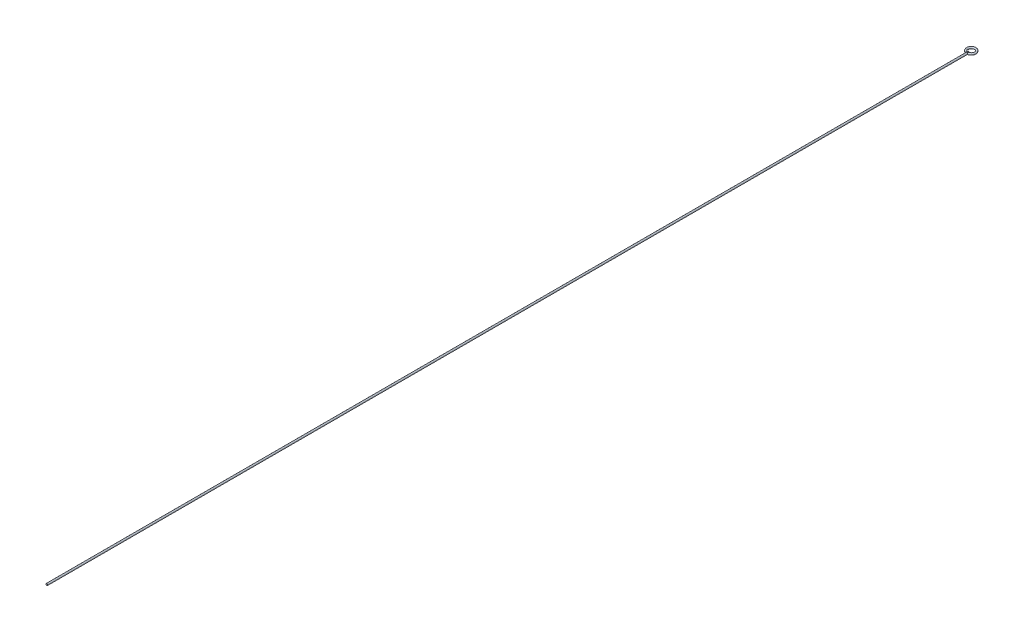
ISO-10303-21;
HEADER;
FILE_DESCRIPTION(('STEP AP214'),'2;1');
FILE_NAME('part.step','',(''),(''),'','','');
FILE_SCHEMA(('AUTOMOTIVE_DESIGN { 1 0 10303 214 1 1 1 1 }'));
ENDSEC;
DATA;
#1=APPLICATION_CONTEXT('core data for automotive mechanical design processes');
#2=APPLICATION_PROTOCOL_DEFINITION('international standard','automotive_design',2000,#1);
#3=PRODUCT_CONTEXT('',#1,'mechanical');
#4=PRODUCT('Part','Part','',(#3));
#5=PRODUCT_RELATED_PRODUCT_CATEGORY('part','',(#4));
#6=PRODUCT_DEFINITION_FORMATION('','',#4);
#7=PRODUCT_DEFINITION_CONTEXT('part definition',#1,'design');
#8=PRODUCT_DEFINITION('design','',#6,#7);
#9=PRODUCT_DEFINITION_SHAPE('','',#8);
#10=(LENGTH_UNIT() NAMED_UNIT(*) SI_UNIT(.MILLI.,.METRE.));
#11=(NAMED_UNIT(*) PLANE_ANGLE_UNIT() SI_UNIT($,.RADIAN.));
#12=(NAMED_UNIT(*) SI_UNIT($,.STERADIAN.) SOLID_ANGLE_UNIT());
#13=UNCERTAINTY_MEASURE_WITH_UNIT(LENGTH_MEASURE(1.E-05),#10,'distance_accuracy_value','');
#14=(GEOMETRIC_REPRESENTATION_CONTEXT(3) GLOBAL_UNCERTAINTY_ASSIGNED_CONTEXT((#13)) GLOBAL_UNIT_ASSIGNED_CONTEXT((#10,
#11,#12)) REPRESENTATION_CONTEXT('',''));
#15=CARTESIAN_POINT('',(0.,0.,0.));
#16=DIRECTION('',(0.,0.,1.));
#17=DIRECTION('',(1.,0.,0.));
#18=AXIS2_PLACEMENT_3D('',#15,#16,#17);
#19=CARTESIAN_POINT('',(0.,0.,2131.));
#20=DIRECTION('',(0.,0.,-1.));
#21=DIRECTION('',(-1.,0.,0.));
#22=AXIS2_PLACEMENT_3D('',#19,#20,#21);
#23=CYLINDRICAL_SURFACE('',#22,2.);
#24=CARTESIAN_POINT('',(0.,0.,6.));
#25=DIRECTION('',(0.,0.,1.));
#26=DIRECTION('',(1.,0.,0.));
#27=AXIS2_PLACEMENT_3D('',#24,#25,#26);
#28=CIRCLE('',#27,2.);
#29=CARTESIAN_POINT('',(2.,0.,6.));
#30=VERTEX_POINT('',#29);
#31=EDGE_CURVE('E141',#30,#30,#28,.T.);
#32=ORIENTED_EDGE('',*,*,#31,.T.);
#33=EDGE_LOOP('',(#32));
#34=FACE_BOUND('',#33,.T.);
#35=CARTESIAN_POINT('',(0.,0.,8.99999999999995));
#36=DIRECTION('',(0.,-0.707106781186547,-0.707106781186547));
#37=DIRECTION('',(0.,0.707106781186547,-0.707106781186547));
#38=AXIS2_PLACEMENT_3D('',#35,#36,#37);
#39=ELLIPSE('',#38,2.82842712474619,2.);
#40=CARTESIAN_POINT('',(1.35264002569453,1.47321585685503,7.52678414314496));
#41=VERTEX_POINT('',#40);
#42=CARTESIAN_POINT('',(-1.35264002569453,1.47321585685503,7.52678414314496));
#43=VERTEX_POINT('',#42);
#44=EDGE_CURVE('E67',#41,#43,#39,.F.);
#45=ORIENTED_EDGE('',*,*,#44,.F.);
#46=CARTESIAN_POINT('',(0.,2.,9.));
#47=CARTESIAN_POINT('',(0.00210812272485549,1.99999999524163,8.99789188802901));
#48=CARTESIAN_POINT('',(0.00421593956644162,1.99999666225178,8.99578333024149));
#49=CARTESIAN_POINT('',(0.167613924135622,1.99948039837144,8.83226960574343));
#50=CARTESIAN_POINT('',(0.327073545426945,1.97949150565761,8.66829200657743));
#51=CARTESIAN_POINT('',(0.559345306955797,1.92185890331424,8.42250655543371));
#52=CARTESIAN_POINT('',(0.635774550072601,1.89795770338682,8.34043033607726));
#53=CARTESIAN_POINT('',(0.785828632202429,1.84089832490799,8.17690254413226));
#54=CARTESIAN_POINT('',(0.859454740640768,1.80774439459674,8.09545070246308));
#55=CARTESIAN_POINT('',(0.986802312314143,1.74073148220367,7.95244891859763));
#56=CARTESIAN_POINT('',(1.04121847231176,1.70877538708495,7.89061593086873));
#57=CARTESIAN_POINT('',(1.14772281824378,1.63913978914488,7.7681871378529));
#58=CARTESIAN_POINT('',(1.19981153935845,1.60146161093816,7.70759104990733));
#59=CARTESIAN_POINT('',(1.30118823189935,1.5202366704838,7.58829101877278));
#60=CARTESIAN_POINT('',(1.35048232911553,1.47670351006603,7.52958306965177));
#61=CARTESIAN_POINT('',(1.44590645589761,1.3834030904459,7.41464671127423));
#62=CARTESIAN_POINT('',(1.49203807201466,1.3336389931221,7.35841706383646));
#63=CARTESIAN_POINT('',(1.59107508834011,1.21482851937822,7.23637955182586));
#64=CARTESIAN_POINT('',(1.64298967668924,1.14400888206332,7.17146570606956));
#65=CARTESIAN_POINT('',(1.73936977351839,0.991323551090359,7.04947167026083));
#66=CARTESIAN_POINT('',(1.78384415074728,0.909471221739623,6.99238216846505));
#67=CARTESIAN_POINT('',(1.85334026653697,0.755288037111378,6.9022751968222));
#68=CARTESIAN_POINT('',(1.88046912857674,0.685383347646647,6.86676841761969));
#69=CARTESIAN_POINT('',(1.92743179933544,0.539316860970757,6.80493837359133));
#70=CARTESIAN_POINT('',(1.94727704682289,0.463165106806872,6.77860071222888));
#71=CARTESIAN_POINT('',(1.97556961285693,0.318783066173252,6.74092329606359));
#72=CARTESIAN_POINT('',(1.98534423195506,0.251273624055717,6.7278429328771));
#73=CARTESIAN_POINT('',(1.99790013385232,0.114464445911381,6.7110261722765));
#74=CARTESIAN_POINT('',(2.00068618016804,0.0451659618898008,6.70728341022207));
#75=CARTESIAN_POINT('',(1.99902507748093,-0.0932269459276112,6.70951183766348));
#76=CARTESIAN_POINT('',(1.99457331702574,-0.162321211505731,6.71548922019384));
#77=CARTESIAN_POINT('',(1.97881704351064,-0.298296919509378,6.73657185136085));
#78=CARTESIAN_POINT('',(1.96750720820041,-0.365176600738755,6.75168418920589));
#79=CARTESIAN_POINT('',(1.93506816593579,-0.512441459084677,6.79480275118913));
#80=CARTESIAN_POINT('',(1.91213546025074,-0.591734040697845,6.82515897002035));
#81=CARTESIAN_POINT('',(1.85856088034207,-0.743125211635407,6.89544348555838));
#82=CARTESIAN_POINT('',(1.82790417359937,-0.815209582570209,6.93539019199368));
#83=CARTESIAN_POINT('',(1.74457274468806,-0.984436833153287,7.04285113385104));
#84=CARTESIAN_POINT('',(1.6883570290898,-1.07721453123317,7.11444602840009));
#85=CARTESIAN_POINT('',(1.56655663215454,-1.24776658358752,7.26689981805269));
#86=CARTESIAN_POINT('',(1.50095088388114,-1.32550625145298,7.34777946086476));
#87=CARTESIAN_POINT('',(1.37952593702835,-1.45000149540649,7.49483605281066));
#88=CARTESIAN_POINT('',(1.32520348461172,-1.49969547185001,7.55980886574149));
#89=CARTESIAN_POINT('',(1.21314827324628,-1.5917071804358,7.69205451956285));
#90=CARTESIAN_POINT('',(1.15541377381436,-1.63402110376991,7.75932852679196));
#91=CARTESIAN_POINT('',(1.03704301514678,-1.71159292484037,7.89543290864361));
#92=CARTESIAN_POINT('',(0.976405158426919,-1.74684688145539,7.96426412882959));
#93=CARTESIAN_POINT('',(0.852660755306097,-1.81047203631426,8.10289576687222));
#94=CARTESIAN_POINT('',(0.78955348783574,-1.83884120651604,8.17269646392042));
#95=CARTESIAN_POINT('',(0.610804546614742,-1.90841633093616,8.36786297402596));
#96=CARTESIAN_POINT('',(0.492836854291632,-1.942200198497,8.49380520408929));
#97=CARTESIAN_POINT('',(0.252404421297302,-1.98776362380408,8.74485234646825));
#98=CARTESIAN_POINT('',(0.129951986381222,-1.99959937761332,8.86995857770249));
#99=CARTESIAN_POINT('',(0.00421596897733761,-1.99999666242279,8.99578329472263));
#100=CARTESIAN_POINT('',(0.00210815236588643,-1.99999999546546,8.99789185220298));
#101=CARTESIAN_POINT('',(0.,-2.,9.));
#102=B_SPLINE_CURVE_WITH_KNOTS('',3,(#46,#47,#48,#49,#50,#51,#52,#53,#54,#55,#56,#57,#58,#59,
#60,#61,#62,#63,#64,#65,#66,#67,#68,#69,#70,#71,#72,#73,#74,#75,#76,#77,#78,#79,#80,#81,#82,#83,
#84,#85,#86,#87,#88,#89,#90,#91,#92,#93,#94,#95,#96,#97,#98,#99,#100,#101),.UNSPECIFIED.,.F.,
.F.,(4,2,2,2,2,2,2,2,2,2,2,2,2,2,2,2,2,2,2,2,2,2,2,2,2,2,2,4),(0.,0.00894427763439276,
0.693463340548152,1.03721792390917,1.38081493688326,1.64566760393445,1.91045905299039,
2.17464565570114,2.43869873659253,2.765420344639,3.09174968111581,3.33979698238755,
3.58745304642157,3.7949062300617,4.00221797201264,4.20966185108035,4.41726692462344,
4.67964926094177,4.94253934644232,5.33032605505973,5.71899682912705,6.01320435682701,
6.30756327711401,6.60208606362033,6.8966955022802,7.42273283312614,7.94742142567657,
7.95636570331097),.UNSPECIFIED.);
#103=CARTESIAN_POINT('',(0.,-2.,9.));
#104=VERTEX_POINT('',#103);
#105=EDGE_CURVE('E86',#41,#104,#102,.T.);
#106=ORIENTED_EDGE('',*,*,#105,.T.);
#107=CARTESIAN_POINT('',(0.,-2.,9.));
#108=CARTESIAN_POINT('',(-0.00210812281673464,-1.99999999522043,8.99789188791853));
#109=CARTESIAN_POINT('',(-0.00421593965739362,-1.99999666223077,8.99578333013208));
#110=CARTESIAN_POINT('',(-0.167560181324545,-1.99948056975998,8.8323233880122));
#111=CARTESIAN_POINT('',(-0.32696675195338,-1.97950494761941,8.66840191870725));
#112=CARTESIAN_POINT('',(-0.559216059382703,-1.92189753031176,8.42264488964913));
#113=CARTESIAN_POINT('',(-0.63567067494967,-1.89799351522413,8.34054262259513));
#114=CARTESIAN_POINT('',(-0.785775657620221,-1.84092214721491,8.17696118579845));
#115=CARTESIAN_POINT('',(-0.85942716648386,-1.80775861277157,8.09548177340016));
#116=CARTESIAN_POINT('',(-0.9920433812676,-1.73797377007946,7.94656350032068));
#117=CARTESIAN_POINT('',(-1.05150167163175,-1.70270752073526,7.87892428965972));
#118=CARTESIAN_POINT('',(-1.16759156470104,-1.62529867063073,7.74518027672068));
#119=CARTESIAN_POINT('',(-1.22422391693607,-1.58315790600938,7.67907507009051));
#120=CARTESIAN_POINT('',(-1.33400361220664,-1.49181720763244,7.54931319009775));
#121=CARTESIAN_POINT('',(-1.38716151471322,-1.44264026506811,7.48564936654748));
#122=CARTESIAN_POINT('',(-1.48950133830031,-1.33671412704701,7.36157721996779));
#123=CARTESIAN_POINT('',(-1.53868650148317,-1.27997120842671,7.30116625602252));
#124=CARTESIAN_POINT('',(-1.63590185236871,-1.15355006440853,7.18036815228713));
#125=CARTESIAN_POINT('',(-1.6835409610825,-1.08320730338549,7.12035228256487));
#126=CARTESIAN_POINT('',(-1.77153892677512,-0.932338035959171,7.00824014783504));
#127=CARTESIAN_POINT('',(-1.81190780169888,-0.851825806987339,6.95613300090427));
#128=CARTESIAN_POINT('',(-1.87496019578697,-0.699769267514736,6.87400995593979));
#129=CARTESIAN_POINT('',(-1.89957878737217,-0.630307364371497,6.8416626964872));
#130=CARTESIAN_POINT('',(-1.94158368263275,-0.485699315960796,6.78618200054536));
#131=CARTESIAN_POINT('',(-1.95897695801999,-0.410558733207491,6.76303968312301));
#132=CARTESIAN_POINT('',(-1.98521163434984,-0.255306637811716,6.72803925667524));
#133=CARTESIAN_POINT('',(-1.99396192801052,-0.175151445237371,6.71630138469673));
#134=CARTESIAN_POINT('',(-2.0015846199076,-0.0135488722900314,6.70608008295928));
#135=CARTESIAN_POINT('',(-2.00046509167047,0.0678973975459251,6.70758581990957));
#136=CARTESIAN_POINT('',(-1.98944469125792,0.21629550290041,6.72235289941695));
#137=CARTESIAN_POINT('',(-1.98092098145687,0.283549889390735,6.73377046536731));
#138=CARTESIAN_POINT('',(-1.9576135231973,0.4149813990234,6.76485012458238));
#139=CARTESIAN_POINT('',(-1.94282623610741,0.479156759807489,6.78451687819511));
#140=CARTESIAN_POINT('',(-1.90100607177353,0.62791180686494,6.83980377475538));
#141=CARTESIAN_POINT('',(-1.87144395301354,0.710568557822906,6.87865656362555));
#142=CARTESIAN_POINT('',(-1.8042867883329,0.867089095996453,6.96597031107501));
#143=CARTESIAN_POINT('',(-1.76667353305592,0.94093234988721,7.01445303157465));
#144=CARTESIAN_POINT('',(-1.69516895751138,1.06307112096457,7.1055265444169));
#145=CARTESIAN_POINT('',(-1.66258173877175,1.11322320659098,7.14670138154396));
#146=CARTESIAN_POINT('',(-1.59444312510289,1.20879941091162,7.23200179048099));
#147=CARTESIAN_POINT('',(-1.55889023135597,1.25422111253153,7.27612885205345));
#148=CARTESIAN_POINT('',(-1.44836058319067,1.38390360382743,7.41199469228825));
#149=CARTESIAN_POINT('',(-1.36959019508658,1.46145491791321,7.50711893013921));
#150=CARTESIAN_POINT('',(-1.22702739334483,1.58131390002394,7.67584622558699));
#151=CARTESIAN_POINT('',(-1.1649715539871,1.62747453778939,7.74828398318769));
#152=CARTESIAN_POINT('',(-1.0374568327385,1.71158359329953,7.89500780835266));
#153=CARTESIAN_POINT('',(-0.97199625749404,1.74952787523423,7.96929478586714));
#154=CARTESIAN_POINT('',(-0.838300428260966,1.81737917623812,8.11887848848734));
#155=CARTESIAN_POINT('',(-0.770067593052083,1.84729303549615,8.19417429651397));
#156=CARTESIAN_POINT('',(-0.631214355133998,1.89922653631293,8.34528911285155));
#157=CARTESIAN_POINT('',(-0.560593827584704,1.92124576440157,8.42110814835391));
#158=CARTESIAN_POINT('',(-0.410456441955563,1.95910382152955,8.58013428661545));
#159=CARTESIAN_POINT('',(-0.33074062401078,1.97413702807548,8.66334538900742));
#160=CARTESIAN_POINT('',(-0.1696324996886,1.99444291521224,8.82912635111679));
#161=CARTESIAN_POINT('',(-0.0882430568500704,1.99973105887858,8.91169701933976));
#162=CARTESIAN_POINT('',(-0.00421597799849515,1.99999666510451,8.99578328341028));
#163=CARTESIAN_POINT('',(-0.00210816129678702,1.99999999825347,8.99789184094395));
#164=CARTESIAN_POINT('',(0.,2.,9.));
#165=B_SPLINE_CURVE_WITH_KNOTS('',3,(#107,#108,#109,#110,#111,#112,#113,#114,#115,#116,#117,
#118,#119,#120,#121,#122,#123,#124,#125,#126,#127,#128,#129,#130,#131,#132,#133,#134,#135,#136,
#137,#138,#139,#140,#141,#142,#143,#144,#145,#146,#147,#148,#149,#150,#151,#152,#153,#154,#155,
#156,#157,#158,#159,#160,#161,#162,#163,#164),.UNSPECIFIED.,.F.,.F.,(4,2,2,2,2,2,2,2,2,2,2,2,2,
2,2,2,2,2,2,2,2,2,2,2,2,2,2,2,4),(0.,0.00894427763439247,0.693235284872066,1.03709620770501,
1.38081553668151,1.67070137815846,1.96050991937383,2.2493922465932,2.53803638718291,
2.84925187412126,3.16003518783422,3.40061645321139,3.64096503933566,3.88382097631995,
4.12647827529289,4.3318119603711,4.53726180452924,4.82365829646621,5.11070951146949,
5.32825416948067,5.54590944600044,5.98174983211696,6.29931050487529,6.61703065626395,
6.93447931365045,7.2519445945319,7.60017195305405,7.94784628099176,7.95679055862615),.UNSPECIFIED.);
#166=EDGE_CURVE('E53',#104,#43,#165,.T.);
#167=ORIENTED_EDGE('',*,*,#166,.T.);
#168=EDGE_LOOP('',(#45,#106,#167));
#169=FACE_BOUND('',#168,.T.);
#170=ADVANCED_FACE('F44',(#34,#169),#23,.T.);
#171=CARTESIAN_POINT('',(0.,0.,0.));
#172=DIRECTION('',(0.,1.,0.));
#173=DIRECTION('',(0.,0.,1.));
#174=AXIS2_PLACEMENT_3D('',#171,#172,#173);
#175=TOROIDAL_SURFACE('',#174,9.,2.);
#176=CARTESIAN_POINT('',(0.,-2.,9.));
#177=CARTESIAN_POINT('',(-0.00210813566360726,-1.99999999621851,9.00210814033236));
#178=CARTESIAN_POINT('',(-0.00421669348929261,-1.99999666316268,9.00421595728533));
#179=CARTESIAN_POINT('',(-0.12548305339383,-1.99961332650367,9.12539691573438));
#180=CARTESIAN_POINT('',(-0.245964359588998,-1.98859475135822,9.24341809029718));
#181=CARTESIAN_POINT('',(-0.487109149983447,-1.94365693286957,9.47530639674726));
#182=CARTESIAN_POINT('',(-0.607772571942503,-1.90969652209743,9.58916567258907));
#183=CARTESIAN_POINT('',(-0.834074541954399,-1.82142087642756,9.79914559797621));
#184=CARTESIAN_POINT('',(-0.940019055922948,-1.76945017202415,9.89590704603683));
#185=CARTESIAN_POINT('',(-1.14583570608838,-1.64364373365732,10.0813493120836));
#186=CARTESIAN_POINT('',(-1.24571685416162,-1.56984145663594,10.170042225139));
#187=CARTESIAN_POINT('',(-1.4136189137677,-1.41825875657198,10.3174275833848));
#188=CARTESIAN_POINT('',(-1.48376905953368,-1.3450605100989,10.3783930320642));
#189=CARTESIAN_POINT('',(-1.61471790048577,-1.18463880690381,10.4913345793827));
#190=CARTESIAN_POINT('',(-1.67552761245912,-1.09743212513255,10.5433212773641));
#191=CARTESIAN_POINT('',(-1.77478428716533,-0.926353710318032,10.6276798861735));
#192=CARTESIAN_POINT('',(-1.81528312788267,-0.84458727760655,10.6618932176933));
#193=CARTESIAN_POINT('',(-1.88550324495746,-0.673365369382744,10.7210043740859));
#194=CARTESIAN_POINT('',(-1.9152296699809,-0.583913592431083,10.7459066493507));
#195=CARTESIAN_POINT('',(-1.96214448660349,-0.398924072215992,10.7851283867986));
#196=CARTESIAN_POINT('',(-1.97925899264492,-0.303353974877754,10.7993854917399));
#197=CARTESIAN_POINT('',(-1.99935443664308,-0.109726153581529,10.8161201338528));
#198=CARTESIAN_POINT('',(-2.00234163694619,-0.01166955122383,10.8186028903542));
#199=CARTESIAN_POINT('',(-1.99439135361487,0.173587411449419,10.8119863102));
#200=CARTESIAN_POINT('',(-1.98481672561042,0.260892659605481,10.8040205709291));
#201=CARTESIAN_POINT('',(-1.95468015907166,0.432190521398464,10.7788867370267));
#202=CARTESIAN_POINT('',(-1.93411849795593,0.516183218618588,10.7617188747453));
#203=CARTESIAN_POINT('',(-1.88288386691657,0.679849447135278,10.7187858931498));
#204=CARTESIAN_POINT('',(-1.85209142640975,0.75945833048192,10.6929191463783));
#205=CARTESIAN_POINT('',(-1.78201198567968,0.911856242748462,10.6337712400145));
#206=CARTESIAN_POINT('',(-1.74272089255953,0.984641961381502,10.6004865077324));
#207=CARTESIAN_POINT('',(-1.64073809578724,1.14917511418757,10.5136014862792));
#208=CARTESIAN_POINT('',(-1.57486133376123,1.23743276935939,10.4571135343963));
#209=CARTESIAN_POINT('',(-1.43364590451805,1.39864089505199,10.3348623366671));
#210=CARTESIAN_POINT('',(-1.35828953628894,1.47156202918398,10.2690817098407));
#211=CARTESIAN_POINT('',(-1.17672911837757,1.62273840358883,10.1088750766247));
#212=CARTESIAN_POINT('',(-1.06823938784045,1.69555124601216,10.0119175958925));
#213=CARTESIAN_POINT('',(-0.845624349368952,1.81687322449657,9.80976484388612));
#214=CARTESIAN_POINT('',(-0.731493260565011,1.86535683770973,9.70456105490035));
#215=CARTESIAN_POINT('',(-0.514979017282203,1.93550014935202,9.50150988048361));
#216=CARTESIAN_POINT('',(-0.412808723642618,1.95965999756638,9.40427073941701));
#217=CARTESIAN_POINT('',(-0.208890587943532,1.99173089977155,9.20704773317217));
#218=CARTESIAN_POINT('',(-0.107142316156886,1.99967122691566,9.10706914339473));
#219=CARTESIAN_POINT('',(-0.00421670053831873,1.9999966647455,9.00421596331506));
#220=CARTESIAN_POINT('',(-0.00210814271059113,1.9999999978573,9.00210814634574));
#221=CARTESIAN_POINT('',(0.,2.,9.));
#222=B_SPLINE_CURVE_WITH_KNOTS('',3,(#176,#177,#178,#179,#180,#181,#182,#183,#184,#185,#186,
#187,#188,#189,#190,#191,#192,#193,#194,#195,#196,#197,#198,#199,#200,#201,#202,#203,#204,#205,
#206,#207,#208,#209,#210,#211,#212,#213,#214,#215,#216,#217,#218,#219,#220,#221),.UNSPECIFIED.,
.F.,.F.,(4,2,2,2,2,2,2,2,2,2,2,2,2,2,2,2,2,2,2,2,2,2,4),(0.,0.00894427764205546,
0.514297822774271,1.0205606047617,1.47676775267206,1.93227935231262,2.28590440078253,
2.63910910129282,2.93026688790138,3.22128533180887,3.51399540911486,3.80657572184656,
4.06989231205833,4.33320225393652,4.59970192125942,4.86633022002375,5.23562030895417,
5.60561049390473,6.09111315566196,6.57712408012804,7.005468666335,7.4330394864561,
7.44198376409816),.UNSPECIFIED.);
#223=CARTESIAN_POINT('',(-1.46478627664232,1.36176398974283,10.3617639897636));
#224=VERTEX_POINT('',#223);
#225=EDGE_CURVE('E84',#224,#104,#222,.F.);
#226=ORIENTED_EDGE('',*,*,#225,.F.);
#227=CARTESIAN_POINT('',(-0.278984328329074,0.252555034282111,10.9804463498279));
#228=CARTESIAN_POINT('',(-0.341032299275194,0.308816785711044,10.971697312331));
#229=CARTESIAN_POINT('',(-0.402787175520897,0.364904444712523,10.9600313604992));
#230=CARTESIAN_POINT('',(-0.525405712639506,0.476579760990675,10.930785774125));
#231=CARTESIAN_POINT('',(-0.586268843536572,0.532167113918051,10.9132027608011));
#232=CARTESIAN_POINT('',(-0.767694114446806,0.698530893909304,10.8512261129245));
#233=CARTESIAN_POINT('',(-0.886323086517937,0.808214805253446,10.797709873668));
#234=CARTESIAN_POINT('',(-1.10449743191817,1.01271340929389,10.6716938216711));
#235=CARTESIAN_POINT('',(-1.20480471291837,1.1079902921113,10.6012588714503));
#236=CARTESIAN_POINT('',(-1.39417858581926,1.29132333733151,10.4393473254541));
#237=CARTESIAN_POINT('',(-1.48327356267481,1.37939752741099,10.3479255891005));
#238=CARTESIAN_POINT('',(-1.62635756425338,1.52501793389885,10.1682545141693));
#239=CARTESIAN_POINT('',(-1.68364716228215,1.58482859193742,10.0844720782639));
#240=CARTESIAN_POINT('',(-1.78657695772627,1.69594632219661,9.90488576402343));
#241=CARTESIAN_POINT('',(-1.83223017729539,1.74726287732439,9.8090955042804));
#242=CARTESIAN_POINT('',(-1.90110327409864,1.82917694209918,9.62711331274587));
#243=CARTESIAN_POINT('',(-1.9269902975717,1.86186577547437,9.54287986653186));
#244=CARTESIAN_POINT('',(-1.96772932464872,1.91803808059917,9.36879939928997));
#245=CARTESIAN_POINT('',(-1.98258736073887,1.94152658129644,9.27895547620386));
#246=CARTESIAN_POINT('',(-1.99988550650642,1.97751775227634,9.09509029651349));
#247=CARTESIAN_POINT('',(-2.00222547074295,1.98993116631186,9.00104140349721));
#248=CARTESIAN_POINT('',(-1.99343855447658,2.00184136461934,8.81276236079122));
#249=CARTESIAN_POINT('',(-1.98232357275786,2.00134955358552,8.71853244472223));
#250=CARTESIAN_POINT('',(-1.94945124558754,1.98787383671371,8.545742041081));
#251=CARTESIAN_POINT('',(-1.92927472739967,1.97653104786835,8.46674323998275));
#252=CARTESIAN_POINT('',(-1.8802445945597,1.9441425260652,8.31360003088698));
#253=CARTESIAN_POINT('',(-1.85139024102706,1.92309596679151,8.23945603691038));
#254=CARTESIAN_POINT('',(-1.78647810372815,1.87228462849486,8.09744024527687));
#255=CARTESIAN_POINT('',(-1.75040456498548,1.8425007138606,8.02958264921749));
#256=CARTESIAN_POINT('',(-1.67273510562387,1.775591134665,7.901090213176));
#257=CARTESIAN_POINT('',(-1.63113712065219,1.73846272309056,7.84045808932736));
#258=CARTESIAN_POINT('',(-1.51966530693271,1.63595602016267,7.69498754403719));
#259=CARTESIAN_POINT('',(-1.4468988727737,1.56632630725528,7.61536016202647));
#260=CARTESIAN_POINT('',(-1.29554727273083,1.41689166603998,7.4727694003756));
#261=CARTESIAN_POINT('',(-1.21694506020552,1.33705639383153,7.4098575114432));
#262=CARTESIAN_POINT('',(-1.07647731662475,1.19121159753111,7.31282586876721));
#263=CARTESIAN_POINT('',(-1.01528633060277,1.12667292415188,7.27543401999356));
#264=CARTESIAN_POINT('',(-0.891732713458826,0.994686038754979,7.20842059482677));
#265=CARTESIAN_POINT('',(-0.829369415231154,0.927236139956455,7.17880359555519));
#266=CARTESIAN_POINT('',(-0.703957264882275,0.790267081339172,7.12675337578009));
#267=CARTESIAN_POINT('',(-0.640908411073402,0.720747916425671,7.10432017296539));
#268=CARTESIAN_POINT('',(-0.514428022286602,0.580297397907398,7.06616318299553));
#269=CARTESIAN_POINT('',(-0.450996645568032,0.509366603673868,7.05043679150805));
#270=CARTESIAN_POINT('',(-0.323965494201565,0.366657387279736,7.02535199039301));
#271=CARTESIAN_POINT('',(-0.260365898896941,0.294879702930309,7.01598840209356));
#272=CARTESIAN_POINT('',(-0.133144091242998,0.150965904072657,7.00341492179225));
#273=CARTESIAN_POINT('',(-0.0695220246822158,0.0788304023982243,7.00019676003563));
#274=CARTESIAN_POINT('',(-0.00394403870693451,0.00447211926849953,7.00000292094687));
#275=CARTESIAN_POINT('',(-0.00197201055846326,0.00223604965939209,7.00000000461182));
#276=CARTESIAN_POINT('',(0.,0.,6.99999999999994));
#277=B_SPLINE_CURVE_WITH_KNOTS('',3,(#227,#228,#229,#230,#231,#232,#233,#234,#235,#236,#237,
#238,#239,#240,#241,#242,#243,#244,#245,#246,#247,#248,#249,#250,#251,#252,#253,#254,#255,#256,
#257,#258,#259,#260,#261,#262,#263,#264,#265,#266,#267,#268,#269,#270,#271,#272,#273,#274,#275,
#276),.UNSPECIFIED.,.F.,.F.,(4,2,2,2,2,2,2,2,2,2,2,2,2,2,2,2,2,2,2,2,2,2,2,2,4),(0.,
0.252525007273027,0.505194457653169,1.01362887360167,1.47768174343743,1.94053512102782,
2.29273223056546,2.64453345203281,2.925407340084,3.20612748610629,3.48909009077905,
3.77180264222164,4.01756468907104,4.26334766743381,4.50967300376842,4.75609064631938,
5.13909450396268,5.52326484315896,5.81231843331428,6.1015418121403,6.39076590312239,
6.67987758256171,6.96875367187785,7.25724075279862,7.26618502898769),.UNSPECIFIED.);
#278=EDGE_CURVE('E62',#224,#43,#277,.T.);
#279=ORIENTED_EDGE('',*,*,#278,.T.);
#280=ORIENTED_EDGE('',*,*,#166,.F.);
#281=EDGE_LOOP('',(#226,#279,#280));
#282=FACE_BOUND('',#281,.T.);
#283=ORIENTED_EDGE('',*,*,#105,.F.);
#284=CARTESIAN_POINT('',(0.,0.,6.99999999999994));
#285=CARTESIAN_POINT('',(0.00197200558539978,0.00223604415623799,7.00000000726764));
#286=CARTESIAN_POINT('',(0.00394403367869625,0.00447211383449829,7.00000292351707));
#287=CARTESIAN_POINT('',(0.086309510355738,0.0978655855921385,7.00024627615483));
#288=CARTESIAN_POINT('',(0.166736821605377,0.18905342113691,7.00532037436683));
#289=CARTESIAN_POINT('',(0.327444795800098,0.370596847578183,7.02532394244063));
#290=CARTESIAN_POINT('',(0.407725259679,0.460951608979088,7.04026234333921));
#291=CARTESIAN_POINT('',(0.567879896610451,0.639882864434265,7.08053740597835));
#292=CARTESIAN_POINT('',(0.647753628116782,0.728457646675771,7.1058836179045));
#293=CARTESIAN_POINT('',(0.806444403308602,0.902453230817283,7.16781686480063));
#294=CARTESIAN_POINT('',(0.885262439152536,0.987877149100629,7.20439244012978));
#295=CARTESIAN_POINT('',(1.04564486296813,1.15898062137926,7.29251965623021));
#296=CARTESIAN_POINT('',(1.12710034671618,1.24438304255954,7.34482194644957));
#297=CARTESIAN_POINT('',(1.28610504507349,1.40733023796999,7.46512479010024));
#298=CARTESIAN_POINT('',(1.36366150778746,1.48488988537231,7.53309479608316));
#299=CARTESIAN_POINT('',(1.49756871468223,1.61469797300902,7.67158913901954));
#300=CARTESIAN_POINT('',(1.55511522853616,1.66893816948891,7.7390623418424));
#301=CARTESIAN_POINT('',(1.66336950177998,1.76752948086768,7.88578374284636));
#302=CARTESIAN_POINT('',(1.71408570020292,1.81189284396914,7.9650171516315));
#303=CARTESIAN_POINT('',(1.79711596910519,1.88090689029902,8.11879309318628));
#304=CARTESIAN_POINT('',(1.83109831493492,1.90768893584303,8.19147006163587));
#305=CARTESIAN_POINT('',(1.89073428464265,1.95152621952012,8.34293718373426));
#306=CARTESIAN_POINT('',(1.91639339079346,1.96858786581904,8.42172327093353));
#307=CARTESIAN_POINT('',(1.95797599907966,1.99218097146844,8.58366027549327));
#308=CARTESIAN_POINT('',(1.97386558511434,1.99867587404283,8.66682532257792));
#309=CARTESIAN_POINT('',(1.9949467082737,2.00095739395134,8.83464786754227));
#310=CARTESIAN_POINT('',(2.00013648924427,1.99674225370444,8.91930560811777));
#311=CARTESIAN_POINT('',(1.99986498537268,1.97882488569162,9.08311828828159));
#312=CARTESIAN_POINT('',(1.9949386956797,1.96562264796312,9.16233201549185));
#313=CARTESIAN_POINT('',(1.97612867546671,1.93133293095876,9.3179011947627));
#314=CARTESIAN_POINT('',(1.96224320746574,1.91024392251082,9.39425608936153));
#315=CARTESIAN_POINT('',(1.92464215418107,1.85892642359147,9.55029763452883));
#316=CARTESIAN_POINT('',(1.90007625681985,1.82799058866414,9.62954341632031));
#317=CARTESIAN_POINT('',(1.8426167995583,1.75958201275042,9.78192698871827));
#318=CARTESIAN_POINT('',(1.80971758433926,1.72210483794423,9.85506058634919));
#319=CARTESIAN_POINT('',(1.71797400907648,1.62109322518337,10.030955991012));
#320=CARTESIAN_POINT('',(1.65452970899772,1.55413594148303,10.1293739473849));
#321=CARTESIAN_POINT('',(1.51540431846422,1.41176376183523,10.3101994714906));
#322=CARTESIAN_POINT('',(1.43969568884161,1.33632995169079,10.3925700664963));
#323=CARTESIAN_POINT('',(1.25606989383751,1.156982448241,10.5627369340911));
#324=CARTESIAN_POINT('',(1.14515978525165,1.05112797501227,10.6452506308595));
#325=CARTESIAN_POINT('',(0.913514852246209,0.833467275133547,10.7843060091386));
#326=CARTESIAN_POINT('',(0.79277725312767,0.721659370691553,10.8408403254659));
#327=CARTESIAN_POINT('',(0.605282623299159,0.549552452227408,10.9074164692394));
#328=CARTESIAN_POINT('',(0.540583762792071,0.490425763600587,10.9267299827533));
#329=CARTESIAN_POINT('',(0.410356584806322,0.371779468878348,10.9585901567271));
#330=CARTESIAN_POINT('',(0.34483237874118,0.312262225747122,10.9711623786155));
#331=CARTESIAN_POINT('',(0.278984328328222,0.252555034283174,10.9804463498283));
#332=B_SPLINE_CURVE_WITH_KNOTS('',3,(#284,#285,#286,#287,#288,#289,#290,#291,#292,#293,#294,
#295,#296,#297,#298,#299,#300,#301,#302,#303,#304,#305,#306,#307,#308,#309,#310,#311,#312,#313,
#314,#315,#316,#317,#318,#319,#320,#321,#322,#323,#324,#325,#326,#327,#328,#329,#330,#331),
.UNSPECIFIED.,.F.,.F.,(4,2,2,2,2,2,2,2,2,2,2,2,2,2,2,2,2,2,2,2,2,2,2,4),(0.,0.00894427618999834,
0.373570720432245,0.738527747131717,1.10382040864581,1.46874151872556,1.85500097537943,
2.24051361568764,2.55127046490325,2.86163977286961,3.11431912299534,3.36683170111989,
3.62021602994925,3.87364194332273,4.11401066402534,4.3544260141886,4.61909306662194,
4.88394021605999,5.28636627144298,5.68970881726486,6.20933895931852,6.729116326351,
6.99813996458008,7.26613618122504),.UNSPECIFIED.);
#333=CARTESIAN_POINT('',(1.46478627664232,1.36176398974283,10.3617639897636));
#334=VERTEX_POINT('',#333);
#335=EDGE_CURVE('E88',#41,#334,#332,.T.);
#336=ORIENTED_EDGE('',*,*,#335,.T.);
#337=CARTESIAN_POINT('',(0.,-2.,9.));
#338=CARTESIAN_POINT('',(0.00210813566360726,-1.99999999621851,9.00210814033236));
#339=CARTESIAN_POINT('',(0.00421669348929261,-1.99999666316268,9.00421595728533));
#340=CARTESIAN_POINT('',(0.12548305339383,-1.99961332650367,9.12539691573438));
#341=CARTESIAN_POINT('',(0.245964359588998,-1.98859475135822,9.24341809029718));
#342=CARTESIAN_POINT('',(0.487109149983447,-1.94365693286957,9.47530639674726));
#343=CARTESIAN_POINT('',(0.607772571942503,-1.90969652209743,9.58916567258907));
#344=CARTESIAN_POINT('',(0.834074541954399,-1.82142087642756,9.79914559797621));
#345=CARTESIAN_POINT('',(0.940019055922948,-1.76945017202415,9.89590704603683));
#346=CARTESIAN_POINT('',(1.14583570608838,-1.64364373365732,10.0813493120836));
#347=CARTESIAN_POINT('',(1.24571685416162,-1.56984145663594,10.170042225139));
#348=CARTESIAN_POINT('',(1.4136189137677,-1.41825875657198,10.3174275833848));
#349=CARTESIAN_POINT('',(1.48376905953368,-1.3450605100989,10.3783930320642));
#350=CARTESIAN_POINT('',(1.61471790048577,-1.18463880690381,10.4913345793827));
#351=CARTESIAN_POINT('',(1.67552761245912,-1.09743212513255,10.5433212773641));
#352=CARTESIAN_POINT('',(1.77478428716533,-0.926353710318032,10.6276798861735));
#353=CARTESIAN_POINT('',(1.81528312788267,-0.84458727760655,10.6618932176933));
#354=CARTESIAN_POINT('',(1.88550324495746,-0.673365369382744,10.7210043740859));
#355=CARTESIAN_POINT('',(1.9152296699809,-0.583913592431083,10.7459066493507));
#356=CARTESIAN_POINT('',(1.96214448660349,-0.398924072215992,10.7851283867986));
#357=CARTESIAN_POINT('',(1.97925899264492,-0.303353974877754,10.7993854917399));
#358=CARTESIAN_POINT('',(1.99935443664308,-0.109726153581529,10.8161201338528));
#359=CARTESIAN_POINT('',(2.00234163694619,-0.01166955122383,10.8186028903542));
#360=CARTESIAN_POINT('',(1.99439135361487,0.173587411449419,10.8119863102));
#361=CARTESIAN_POINT('',(1.98481672561042,0.260892659605481,10.8040205709291));
#362=CARTESIAN_POINT('',(1.95468015907166,0.432190521398464,10.7788867370267));
#363=CARTESIAN_POINT('',(1.93411849795593,0.516183218618588,10.7617188747453));
#364=CARTESIAN_POINT('',(1.88288386691657,0.679849447135278,10.7187858931498));
#365=CARTESIAN_POINT('',(1.85209142640975,0.75945833048192,10.6929191463783));
#366=CARTESIAN_POINT('',(1.78201198567968,0.911856242748462,10.6337712400145));
#367=CARTESIAN_POINT('',(1.74272089255953,0.984641961381502,10.6004865077324));
#368=CARTESIAN_POINT('',(1.64073809578724,1.14917511418757,10.5136014862792));
#369=CARTESIAN_POINT('',(1.57486133376123,1.23743276935939,10.4571135343963));
#370=CARTESIAN_POINT('',(1.43364590451805,1.39864089505199,10.3348623366671));
#371=CARTESIAN_POINT('',(1.35828953628894,1.47156202918398,10.2690817098407));
#372=CARTESIAN_POINT('',(1.17672911837757,1.62273840358883,10.1088750766247));
#373=CARTESIAN_POINT('',(1.06823938784045,1.69555124601216,10.0119175958925));
#374=CARTESIAN_POINT('',(0.845624349368952,1.81687322449657,9.80976484388612));
#375=CARTESIAN_POINT('',(0.731493260565011,1.86535683770973,9.70456105490035));
#376=CARTESIAN_POINT('',(0.514979017282203,1.93550014935202,9.50150988048361));
#377=CARTESIAN_POINT('',(0.412808723642618,1.95965999756638,9.40427073941701));
#378=CARTESIAN_POINT('',(0.208890587943532,1.99173089977155,9.20704773317217));
#379=CARTESIAN_POINT('',(0.107142316156886,1.99967122691566,9.10706914339473));
#380=CARTESIAN_POINT('',(0.00421670053831873,1.9999966647455,9.00421596331506));
#381=CARTESIAN_POINT('',(0.00210814271059113,1.9999999978573,9.00210814634574));
#382=CARTESIAN_POINT('',(0.,2.,9.));
#383=B_SPLINE_CURVE_WITH_KNOTS('',3,(#337,#338,#339,#340,#341,#342,#343,#344,#345,#346,#347,
#348,#349,#350,#351,#352,#353,#354,#355,#356,#357,#358,#359,#360,#361,#362,#363,#364,#365,#366,
#367,#368,#369,#370,#371,#372,#373,#374,#375,#376,#377,#378,#379,#380,#381,#382),.UNSPECIFIED.,
.F.,.F.,(4,2,2,2,2,2,2,2,2,2,2,2,2,2,2,2,2,2,2,2,2,2,4),(0.,0.00894427764205546,
0.514297822774271,1.0205606047617,1.47676775267206,1.93227935231262,2.28590440078253,
2.63910910129282,2.93026688790138,3.22128533180887,3.51399540911486,3.80657572184656,
4.06989231205833,4.33320225393652,4.59970192125942,4.86633022002375,5.23562030895417,
5.60561049390473,6.09111315566196,6.57712408012804,7.005468666335,7.4330394864561,
7.44198376409816),.UNSPECIFIED.);
#384=EDGE_CURVE('E78',#104,#334,#383,.T.);
#385=ORIENTED_EDGE('',*,*,#384,.F.);
#386=EDGE_LOOP('',(#283,#336,#385));
#387=FACE_BOUND('',#386,.T.);
#388=ADVANCED_FACE('F89',(#282,#387),#175,.T.);
#389=CARTESIAN_POINT('',(0.,0.,2131.));
#390=DIRECTION('',(0.,0.,1.));
#391=DIRECTION('',(1.,0.,0.));
#392=AXIS2_PLACEMENT_3D('',#389,#390,#391);
#393=CIRCLE('',#392,2.);
#394=CARTESIAN_POINT('',(2.,0.,2131.));
#395=VERTEX_POINT('',#394);
#396=EDGE_CURVE('E138',#395,#395,#393,.T.);
#397=ORIENTED_EDGE('',*,*,#396,.F.);
#398=EDGE_LOOP('',(#397));
#399=FACE_BOUND('',#398,.T.);
#400=CARTESIAN_POINT('',(0.,0.,8.99999999999995));
#401=DIRECTION('',(0.,0.707106781186547,-0.707106781186547));
#402=DIRECTION('',(0.,-0.707106781186547,-0.707106781186547));
#403=AXIS2_PLACEMENT_3D('',#400,#401,#402);
#404=ELLIPSE('',#403,2.82842712474619,2.);
#405=EDGE_CURVE('E11',#224,#334,#404,.T.);
#406=ORIENTED_EDGE('',*,*,#405,.F.);
#407=ORIENTED_EDGE('',*,*,#225,.T.);
#408=ORIENTED_EDGE('',*,*,#384,.T.);
#409=EDGE_LOOP('',(#406,#407,#408));
#410=FACE_BOUND('',#409,.T.);
#411=ADVANCED_FACE('F85',(#399,#410),#23,.T.);
#412=CARTESIAN_POINT('',(0.,0.,6.));
#413=DIRECTION('',(0.,0.,1.));
#414=DIRECTION('',(1.,0.,0.));
#415=AXIS2_PLACEMENT_3D('',#412,#413,#414);
#416=PLANE('',#415);
#417=ORIENTED_EDGE('',*,*,#31,.F.);
#418=EDGE_LOOP('',(#417));
#419=FACE_BOUND('',#418,.T.);
#420=ADVANCED_FACE('F132',(#419),#416,.F.);
#421=CARTESIAN_POINT('',(0.,0.,2131.));
#422=DIRECTION('',(0.,0.,1.));
#423=DIRECTION('',(1.,0.,0.));
#424=AXIS2_PLACEMENT_3D('',#421,#422,#423);
#425=PLANE('',#424);
#426=ORIENTED_EDGE('',*,*,#396,.T.);
#427=EDGE_LOOP('',(#426));
#428=FACE_BOUND('',#427,.T.);
#429=ADVANCED_FACE('F117',(#428),#425,.T.);
#430=CARTESIAN_POINT('',(0.,2.1,9.));
#431=DIRECTION('',(0.,-1.,0.));
#432=DIRECTION('',(0.,0.,-1.));
#433=AXIS2_PLACEMENT_3D('',#430,#431,#432);
#434=CYLINDRICAL_SURFACE('',#433,2.);
#435=CARTESIAN_POINT('',(0.,2.1,9.));
#436=DIRECTION('',(0.,1.,0.));
#437=DIRECTION('',(0.,0.,1.));
#438=AXIS2_PLACEMENT_3D('',#435,#436,#437);
#439=CIRCLE('',#438,2.);
#440=CARTESIAN_POINT('',(0.,2.1,11.));
#441=VERTEX_POINT('',#440);
#442=EDGE_CURVE('E98',#441,#441,#439,.T.);
#443=ORIENTED_EDGE('',*,*,#442,.F.);
#444=EDGE_LOOP('',(#443));
#445=FACE_BOUND('',#444,.T.);
#446=ORIENTED_EDGE('',*,*,#335,.F.);
#447=ORIENTED_EDGE('',*,*,#44,.T.);
#448=ORIENTED_EDGE('',*,*,#278,.F.);
#449=ORIENTED_EDGE('',*,*,#405,.T.);
#450=EDGE_LOOP('',(#446,#447,#448,#449));
#451=FACE_BOUND('',#450,.T.);
#452=ADVANCED_FACE('F94',(#445,#451),#434,.T.);
#453=CARTESIAN_POINT('',(0.,2.1,9.));
#454=DIRECTION('',(0.,1.,0.));
#455=DIRECTION('',(0.,0.,1.));
#456=AXIS2_PLACEMENT_3D('',#453,#454,#455);
#457=PLANE('',#456);
#458=ORIENTED_EDGE('',*,*,#442,.T.);
#459=EDGE_LOOP('',(#458));
#460=FACE_BOUND('',#459,.T.);
#461=ADVANCED_FACE('F120',(#460),#457,.T.);
#462=CLOSED_SHELL('',(#170,#388,#411,#420,#429,#452,#461));
#463=MANIFOLD_SOLID_BREP('B2',#462);
#464=ADVANCED_BREP_SHAPE_REPRESENTATION('',(#18,#463),#14);
#465=SHAPE_DEFINITION_REPRESENTATION(#9,#464);
ENDSEC;
END-ISO-10303-21;
